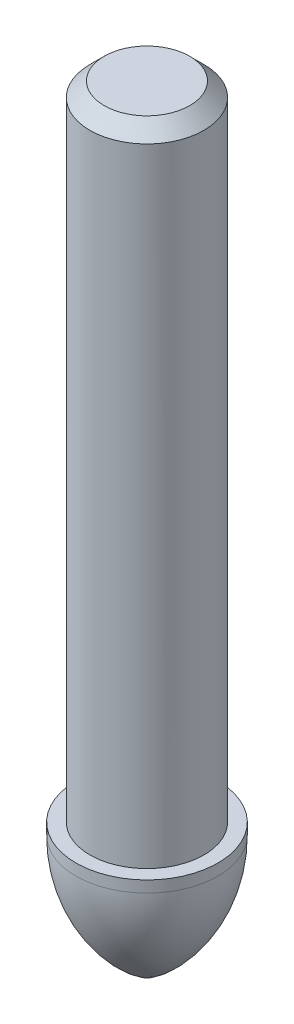
ISO-10303-21;
HEADER;
FILE_DESCRIPTION(('STEP AP214'),'2;1');
FILE_NAME('part.step','',(''),(''),'','','');
FILE_SCHEMA(('AUTOMOTIVE_DESIGN { 1 0 10303 214 1 1 1 1 }'));
ENDSEC;
DATA;
#1=APPLICATION_CONTEXT('core data for automotive mechanical design processes');
#2=APPLICATION_PROTOCOL_DEFINITION('international standard','automotive_design',2000,#1);
#3=PRODUCT_CONTEXT('',#1,'mechanical');
#4=PRODUCT('Part','Part','',(#3));
#5=PRODUCT_RELATED_PRODUCT_CATEGORY('part','',(#4));
#6=PRODUCT_DEFINITION_FORMATION('','',#4);
#7=PRODUCT_DEFINITION_CONTEXT('part definition',#1,'design');
#8=PRODUCT_DEFINITION('design','',#6,#7);
#9=PRODUCT_DEFINITION_SHAPE('','',#8);
#10=(LENGTH_UNIT() NAMED_UNIT(*) SI_UNIT(.MILLI.,.METRE.));
#11=(NAMED_UNIT(*) PLANE_ANGLE_UNIT() SI_UNIT($,.RADIAN.));
#12=(NAMED_UNIT(*) SI_UNIT($,.STERADIAN.) SOLID_ANGLE_UNIT());
#13=UNCERTAINTY_MEASURE_WITH_UNIT(LENGTH_MEASURE(1.E-05),#10,'distance_accuracy_value','');
#14=(GEOMETRIC_REPRESENTATION_CONTEXT(3) GLOBAL_UNCERTAINTY_ASSIGNED_CONTEXT((#13)) GLOBAL_UNIT_ASSIGNED_CONTEXT((#10,
#11,#12)) REPRESENTATION_CONTEXT('',''));
#15=CARTESIAN_POINT('',(0.,0.,0.));
#16=DIRECTION('',(0.,0.,1.));
#17=DIRECTION('',(1.,0.,0.));
#18=AXIS2_PLACEMENT_3D('',#15,#16,#17);
#19=CARTESIAN_POINT('',(0.,-52.9389234482518,0.));
#20=DIRECTION('',(0.,1.,0.));
#21=DIRECTION('',(-1.,0.,0.));
#22=AXIS2_PLACEMENT_3D('',#19,#20,#21);
#23=SPHERICAL_SURFACE('',#22,1.25);
#24=CARTESIAN_POINT('',(0.,-53.9643950996325,0.));
#25=DIRECTION('',(0.,1.,0.));
#26=DIRECTION('',(-1.,0.,0.));
#27=AXIS2_PLACEMENT_3D('',#24,#25,#26);
#28=CIRCLE('',#27,0.714778211905313);
#29=CARTESIAN_POINT('',(-0.714778211905307,-53.9643950996325,0.));
#30=VERTEX_POINT('',#29);
#31=EDGE_CURVE('E60',#30,#30,#28,.T.);
#32=ORIENTED_EDGE('',*,*,#31,.F.);
#33=EDGE_LOOP('',(#32));
#34=FACE_BOUND('',#33,.T.);
#35=ADVANCED_FACE('F48',(#34),#23,.T.);
#36=CARTESIAN_POINT('',(0.,-45.8,0.));
#37=DIRECTION('',(0.,1.,0.));
#38=DIRECTION('',(-1.,0.,0.));
#39=AXIS2_PLACEMENT_3D('',#36,#37,#38);
#40=DEGENERATE_TOROIDAL_SURFACE('',#39,4.976,9.952,.F.);
#41=CARTESIAN_POINT('',(0.,-45.8,0.));
#42=DIRECTION('',(0.,1.,0.));
#43=DIRECTION('',(-1.,0.,0.));
#44=AXIS2_PLACEMENT_3D('',#41,#42,#43);
#45=CIRCLE('',#44,4.976);
#46=CARTESIAN_POINT('',(-4.976,-45.8,0.));
#47=VERTEX_POINT('',#46);
#48=EDGE_CURVE('E64',#47,#47,#45,.T.);
#49=ORIENTED_EDGE('',*,*,#48,.F.);
#50=EDGE_LOOP('',(#49));
#51=FACE_BOUND('',#50,.T.);
#52=ORIENTED_EDGE('',*,*,#31,.T.);
#53=EDGE_LOOP('',(#52));
#54=FACE_BOUND('',#53,.T.);
#55=ADVANCED_FACE('F87',(#51,#54),#40,.F.);
#56=CARTESIAN_POINT('',(0.,0.,0.));
#57=DIRECTION('',(0.,1.,0.));
#58=DIRECTION('',(-1.,0.,0.));
#59=AXIS2_PLACEMENT_3D('',#56,#57,#58);
#60=CYLINDRICAL_SURFACE('',#59,4.976);
#61=CARTESIAN_POINT('',(0.,-45.,0.));
#62=DIRECTION('',(0.,1.,0.));
#63=DIRECTION('',(-1.,0.,0.));
#64=AXIS2_PLACEMENT_3D('',#61,#62,#63);
#65=CIRCLE('',#64,4.976);
#66=CARTESIAN_POINT('',(-4.976,-45.,0.));
#67=VERTEX_POINT('',#66);
#68=EDGE_CURVE('E69',#67,#67,#65,.T.);
#69=ORIENTED_EDGE('',*,*,#68,.F.);
#70=EDGE_LOOP('',(#69));
#71=FACE_BOUND('',#70,.T.);
#72=ORIENTED_EDGE('',*,*,#48,.T.);
#73=EDGE_LOOP('',(#72));
#74=FACE_BOUND('',#73,.T.);
#75=ADVANCED_FACE('F81',(#71,#74),#60,.T.);
#76=CARTESIAN_POINT('',(4.00000000000001,-45.,0.));
#77=DIRECTION('',(0.,-1.,0.));
#78=DIRECTION('',(1.,0.,0.));
#79=AXIS2_PLACEMENT_3D('',#76,#77,#78);
#80=PLANE('',#79);
#81=CARTESIAN_POINT('',(0.,-45.,0.));
#82=DIRECTION('',(0.,1.,0.));
#83=DIRECTION('',(-1.,0.,0.));
#84=AXIS2_PLACEMENT_3D('',#81,#82,#83);
#85=CIRCLE('',#84,4.);
#86=CARTESIAN_POINT('',(-3.99999999999999,-45.,0.));
#87=VERTEX_POINT('',#86);
#88=EDGE_CURVE('E72',#87,#87,#85,.T.);
#89=ORIENTED_EDGE('',*,*,#88,.F.);
#90=EDGE_LOOP('',(#89));
#91=FACE_BOUND('',#90,.T.);
#92=ORIENTED_EDGE('',*,*,#68,.T.);
#93=EDGE_LOOP('',(#92));
#94=FACE_BOUND('',#93,.T.);
#95=ADVANCED_FACE('F78',(#91,#94),#80,.F.);
#96=CARTESIAN_POINT('',(0.,0.,0.));
#97=DIRECTION('',(0.,1.,0.));
#98=DIRECTION('',(-1.,0.,0.));
#99=AXIS2_PLACEMENT_3D('',#96,#97,#98);
#100=CYLINDRICAL_SURFACE('',#99,4.);
#101=CARTESIAN_POINT('',(0.,-1.00000000000001,0.));
#102=DIRECTION('',(0.,-1.,0.));
#103=DIRECTION('',(1.,0.,0.));
#104=AXIS2_PLACEMENT_3D('',#101,#102,#103);
#105=CIRCLE('',#104,4.);
#106=CARTESIAN_POINT('',(4.,-1.00000000000001,0.));
#107=VERTEX_POINT('',#106);
#108=EDGE_CURVE('E10',#107,#107,#105,.T.);
#109=ORIENTED_EDGE('',*,*,#108,.T.);
#110=EDGE_LOOP('',(#109));
#111=FACE_BOUND('',#110,.T.);
#112=ORIENTED_EDGE('',*,*,#88,.T.);
#113=EDGE_LOOP('',(#112));
#114=FACE_BOUND('',#113,.T.);
#115=ADVANCED_FACE('F76',(#111,#114),#100,.T.);
#116=CARTESIAN_POINT('',(0.,0.,0.));
#117=DIRECTION('',(0.,-1.,0.));
#118=DIRECTION('',(1.,0.,0.));
#119=AXIS2_PLACEMENT_3D('',#116,#117,#118);
#120=PLANE('',#119);
#121=CARTESIAN_POINT('',(0.,0.,0.));
#122=DIRECTION('',(0.,-1.,0.));
#123=DIRECTION('',(1.,0.,0.));
#124=AXIS2_PLACEMENT_3D('',#121,#122,#123);
#125=CIRCLE('',#124,2.99999999999999);
#126=CARTESIAN_POINT('',(2.99999999999999,0.,0.));
#127=VERTEX_POINT('',#126);
#128=EDGE_CURVE('E56',#127,#127,#125,.F.);
#129=ORIENTED_EDGE('',*,*,#128,.T.);
#130=EDGE_LOOP('',(#129));
#131=FACE_BOUND('',#130,.T.);
#132=ADVANCED_FACE('F102',(#131),#120,.F.);
#133=CARTESIAN_POINT('',(0.,0.,0.));
#134=DIRECTION('',(0.,-1.,0.));
#135=DIRECTION('',(1.,0.,0.));
#136=AXIS2_PLACEMENT_3D('',#133,#134,#135);
#137=CONICAL_SURFACE('',#136,2.99999999999999,0.785398163397448);
#138=ORIENTED_EDGE('',*,*,#108,.F.);
#139=EDGE_LOOP('',(#138));
#140=FACE_BOUND('',#139,.T.);
#141=ORIENTED_EDGE('',*,*,#128,.F.);
#142=EDGE_LOOP('',(#141));
#143=FACE_BOUND('',#142,.T.);
#144=ADVANCED_FACE('F51',(#140,#143),#137,.T.);
#145=CLOSED_SHELL('',(#35,#55,#75,#95,#115,#132,#144));
#146=MANIFOLD_SOLID_BREP('B2',#145);
#147=ADVANCED_BREP_SHAPE_REPRESENTATION('',(#18,#146),#14);
#148=SHAPE_DEFINITION_REPRESENTATION(#9,#147);
ENDSEC;
END-ISO-10303-21;
